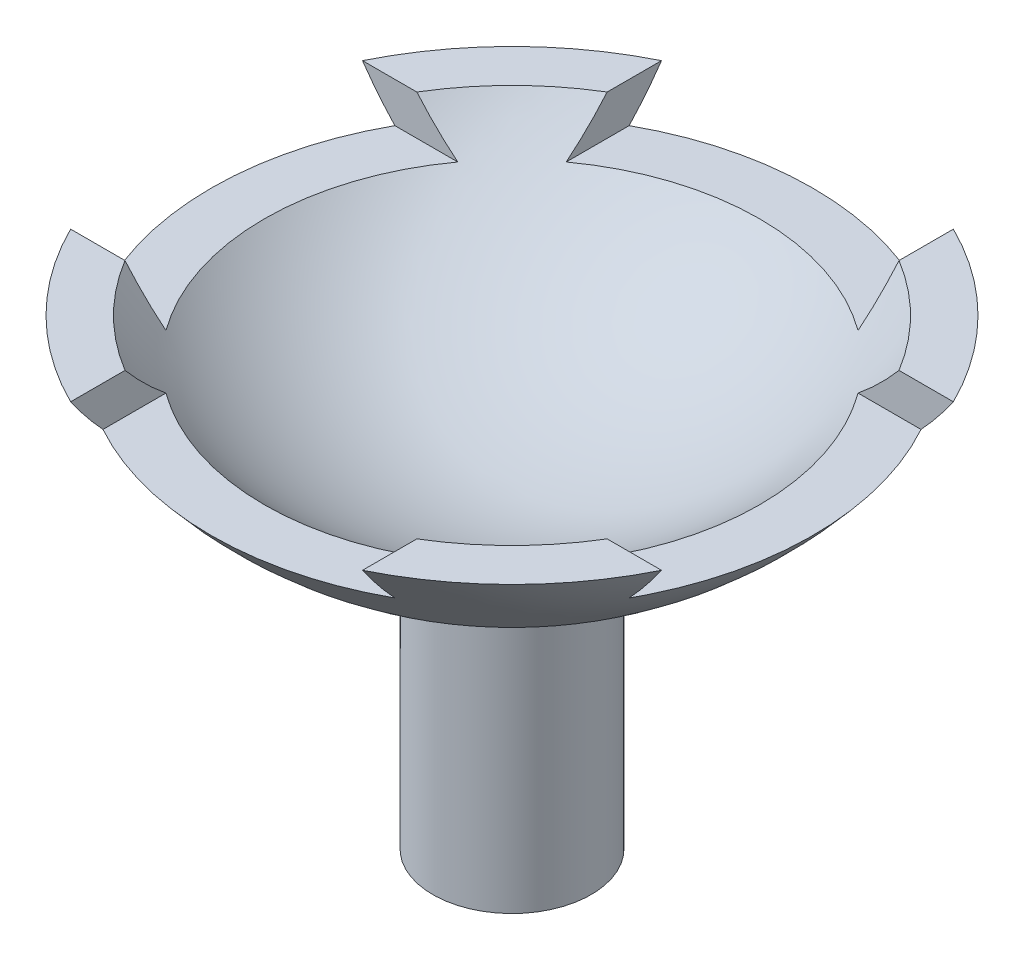
ISO-10303-21;
HEADER;
FILE_DESCRIPTION(('STEP AP214'),'2;1');
FILE_NAME('part.step','',(''),(''),'','','');
FILE_SCHEMA(('AUTOMOTIVE_DESIGN { 1 0 10303 214 1 1 1 1 }'));
ENDSEC;
DATA;
#1=APPLICATION_CONTEXT('core data for automotive mechanical design processes');
#2=APPLICATION_PROTOCOL_DEFINITION('international standard','automotive_design',2000,#1);
#3=PRODUCT_CONTEXT('',#1,'mechanical');
#4=PRODUCT('Part','Part','',(#3));
#5=PRODUCT_RELATED_PRODUCT_CATEGORY('part','',(#4));
#6=PRODUCT_DEFINITION_FORMATION('','',#4);
#7=PRODUCT_DEFINITION_CONTEXT('part definition',#1,'design');
#8=PRODUCT_DEFINITION('design','',#6,#7);
#9=PRODUCT_DEFINITION_SHAPE('','',#8);
#10=(LENGTH_UNIT() NAMED_UNIT(*) SI_UNIT(.MILLI.,.METRE.));
#11=(NAMED_UNIT(*) PLANE_ANGLE_UNIT() SI_UNIT($,.RADIAN.));
#12=(NAMED_UNIT(*) SI_UNIT($,.STERADIAN.) SOLID_ANGLE_UNIT());
#13=UNCERTAINTY_MEASURE_WITH_UNIT(LENGTH_MEASURE(1.E-05),#10,'distance_accuracy_value','');
#14=(GEOMETRIC_REPRESENTATION_CONTEXT(3) GLOBAL_UNCERTAINTY_ASSIGNED_CONTEXT((#13)) GLOBAL_UNIT_ASSIGNED_CONTEXT((#10,
#11,#12)) REPRESENTATION_CONTEXT('',''));
#15=CARTESIAN_POINT('',(0.,0.,0.));
#16=DIRECTION('',(0.,0.,1.));
#17=DIRECTION('',(1.,0.,0.));
#18=AXIS2_PLACEMENT_3D('',#15,#16,#17);
#19=CARTESIAN_POINT('',(0.,50.5312438925075,0.));
#20=DIRECTION('',(0.,1.,0.));
#21=DIRECTION('',(1.,0.,0.));
#22=AXIS2_PLACEMENT_3D('',#19,#20,#21);
#23=SPHERICAL_SURFACE('',#22,29.4);
#24=CARTESIAN_POINT('',(0.,22.0103986648705,0.));
#25=DIRECTION('',(0.,1.,0.));
#26=DIRECTION('',(-1.,0.,0.));
#27=AXIS2_PLACEMENT_3D('',#24,#25,#26);
#28=CIRCLE('',#27,7.13592233009709);
#29=CARTESIAN_POINT('',(-7.1359223300971,22.0103986648705,0.));
#30=VERTEX_POINT('',#29);
#31=EDGE_CURVE('E50',#30,#30,#28,.T.);
#32=ORIENTED_EDGE('',*,*,#31,.T.);
#33=EDGE_LOOP('',(#32));
#34=FACE_BOUND('',#33,.T.);
#35=CARTESIAN_POINT('',(0.,50.5312438925075,11.055));
#36=DIRECTION('',(0.,0.,1.));
#37=DIRECTION('',(1.,0.,0.));
#38=AXIS2_PLACEMENT_3D('',#35,#36,#37);
#39=CIRCLE('',#38,27.2423746211669);
#40=CARTESIAN_POINT('',(-19.9312788171006,31.96,11.0550000000001));
#41=VERTEX_POINT('',#40);
#42=CARTESIAN_POINT('',(-22.3814083147475,35.,11.0550000000001));
#43=VERTEX_POINT('',#42);
#44=EDGE_CURVE('E183',#41,#43,#39,.F.);
#45=ORIENTED_EDGE('',*,*,#44,.F.);
#46=CARTESIAN_POINT('',(0.,31.96,0.));
#47=DIRECTION('',(0.,-1.,0.));
#48=DIRECTION('',(1.,0.,0.));
#49=AXIS2_PLACEMENT_3D('',#46,#47,#48);
#50=CIRCLE('',#49,22.7918603954351);
#51=CARTESIAN_POINT('',(-19.9312788171006,31.96,-11.0549999999999));
#52=VERTEX_POINT('',#51);
#53=EDGE_CURVE('E166',#52,#41,#50,.F.);
#54=ORIENTED_EDGE('',*,*,#53,.F.);
#55=CARTESIAN_POINT('',(0.,50.5312438925075,-11.055));
#56=DIRECTION('',(0.,0.,-1.));
#57=DIRECTION('',(-1.,0.,0.));
#58=AXIS2_PLACEMENT_3D('',#55,#56,#57);
#59=CIRCLE('',#58,27.2423746211669);
#60=CARTESIAN_POINT('',(-22.3814083147475,35.,-11.0549999999999));
#61=VERTEX_POINT('',#60);
#62=EDGE_CURVE('E158',#61,#52,#59,.F.);
#63=ORIENTED_EDGE('',*,*,#62,.F.);
#64=CARTESIAN_POINT('',(0.,35.,0.));
#65=DIRECTION('',(0.,1.,0.));
#66=DIRECTION('',(-1.,0.,0.));
#67=AXIS2_PLACEMENT_3D('',#64,#65,#66);
#68=CIRCLE('',#67,24.9627815587816);
#69=CARTESIAN_POINT('',(-11.055,35.,-22.3814083147475));
#70=VERTEX_POINT('',#69);
#71=EDGE_CURVE('E264',#70,#61,#68,.T.);
#72=ORIENTED_EDGE('',*,*,#71,.F.);
#73=CARTESIAN_POINT('',(-11.055,50.5312438925075,0.));
#74=DIRECTION('',(-1.,0.,0.));
#75=DIRECTION('',(0.,0.,1.));
#76=AXIS2_PLACEMENT_3D('',#73,#74,#75);
#77=CIRCLE('',#76,27.2423746211669);
#78=CARTESIAN_POINT('',(-11.055,31.96,-19.9312788171006));
#79=VERTEX_POINT('',#78);
#80=EDGE_CURVE('E244',#79,#70,#77,.F.);
#81=ORIENTED_EDGE('',*,*,#80,.F.);
#82=CARTESIAN_POINT('',(0.,31.96,0.));
#83=DIRECTION('',(0.,-1.,0.));
#84=DIRECTION('',(0.,0.,-1.));
#85=AXIS2_PLACEMENT_3D('',#82,#83,#84);
#86=CIRCLE('',#85,22.7918603954351);
#87=CARTESIAN_POINT('',(11.055,31.96,-19.9312788171006));
#88=VERTEX_POINT('',#87);
#89=EDGE_CURVE('E256',#88,#79,#86,.F.);
#90=ORIENTED_EDGE('',*,*,#89,.F.);
#91=CARTESIAN_POINT('',(11.055,50.5312438925075,0.));
#92=DIRECTION('',(1.,0.,0.));
#93=DIRECTION('',(0.,0.,-1.));
#94=AXIS2_PLACEMENT_3D('',#91,#92,#93);
#95=CIRCLE('',#94,27.2423746211669);
#96=CARTESIAN_POINT('',(11.055,35.,-22.3814083147475));
#97=VERTEX_POINT('',#96);
#98=EDGE_CURVE('E238',#97,#88,#95,.F.);
#99=ORIENTED_EDGE('',*,*,#98,.F.);
#100=CARTESIAN_POINT('',(22.3814083147474,35.,-11.0550000000002));
#101=VERTEX_POINT('',#100);
#102=EDGE_CURVE('E263',#101,#97,#68,.T.);
#103=ORIENTED_EDGE('',*,*,#102,.F.);
#104=CARTESIAN_POINT('',(-1.19264425554686E-13,50.5312438925075,-11.055));
#105=DIRECTION('',(0.,0.,-1.));
#106=DIRECTION('',(-1.,0.,0.));
#107=AXIS2_PLACEMENT_3D('',#104,#105,#106);
#108=CIRCLE('',#107,27.2423746211669);
#109=CARTESIAN_POINT('',(19.9312788171005,31.96,-11.0550000000002));
#110=VERTEX_POINT('',#109);
#111=EDGE_CURVE('E218',#110,#101,#108,.F.);
#112=ORIENTED_EDGE('',*,*,#111,.F.);
#113=CARTESIAN_POINT('',(0.,31.96,0.));
#114=DIRECTION('',(0.,-1.,0.));
#115=DIRECTION('',(0.,0.,-1.));
#116=AXIS2_PLACEMENT_3D('',#113,#114,#115);
#117=CIRCLE('',#116,22.7918603954351);
#118=CARTESIAN_POINT('',(19.9312788171007,31.96,11.0549999999998));
#119=VERTEX_POINT('',#118);
#120=EDGE_CURVE('E194',#119,#110,#117,.F.);
#121=ORIENTED_EDGE('',*,*,#120,.F.);
#122=CARTESIAN_POINT('',(1.12325531650779E-13,50.5312438925075,11.055));
#123=DIRECTION('',(0.,0.,1.));
#124=DIRECTION('',(1.,0.,0.));
#125=AXIS2_PLACEMENT_3D('',#122,#123,#124);
#126=CIRCLE('',#125,27.2423746211669);
#127=CARTESIAN_POINT('',(22.3814083147476,35.,11.0549999999998));
#128=VERTEX_POINT('',#127);
#129=EDGE_CURVE('E216',#128,#119,#126,.F.);
#130=ORIENTED_EDGE('',*,*,#129,.F.);
#131=CARTESIAN_POINT('',(11.055,35.,22.3814083147475));
#132=VERTEX_POINT('',#131);
#133=EDGE_CURVE('E332',#132,#128,#68,.T.);
#134=ORIENTED_EDGE('',*,*,#133,.F.);
#135=CARTESIAN_POINT('',(11.055,50.5312438925075,0.));
#136=DIRECTION('',(1.,0.,0.));
#137=DIRECTION('',(0.,1.,0.));
#138=AXIS2_PLACEMENT_3D('',#135,#136,#137);
#139=CIRCLE('',#138,27.2423746211669);
#140=CARTESIAN_POINT('',(11.055,31.96,19.9312788171006));
#141=VERTEX_POINT('',#140);
#142=EDGE_CURVE('E200',#141,#132,#139,.F.);
#143=ORIENTED_EDGE('',*,*,#142,.F.);
#144=CARTESIAN_POINT('',(0.,31.96,0.));
#145=DIRECTION('',(0.,-1.,0.));
#146=DIRECTION('',(1.,0.,0.));
#147=AXIS2_PLACEMENT_3D('',#144,#145,#146);
#148=CIRCLE('',#147,22.7918603954351);
#149=CARTESIAN_POINT('',(-11.055,31.96,19.9312788171006));
#150=VERTEX_POINT('',#149);
#151=EDGE_CURVE('E180',#150,#141,#148,.F.);
#152=ORIENTED_EDGE('',*,*,#151,.F.);
#153=CARTESIAN_POINT('',(-11.055,50.5312438925075,0.));
#154=DIRECTION('',(-1.,0.,0.));
#155=DIRECTION('',(0.,-1.,0.));
#156=AXIS2_PLACEMENT_3D('',#153,#154,#155);
#157=CIRCLE('',#156,27.2423746211669);
#158=CARTESIAN_POINT('',(-11.055,35.,22.3814083147475));
#159=VERTEX_POINT('',#158);
#160=EDGE_CURVE('E198',#159,#150,#157,.F.);
#161=ORIENTED_EDGE('',*,*,#160,.F.);
#162=EDGE_CURVE('E267',#43,#159,#68,.T.);
#163=ORIENTED_EDGE('',*,*,#162,.F.);
#164=EDGE_LOOP('',(#45,#54,#63,#72,#81,#90,#99,#103,#112,#121,#130,#134,#143,#152,#161,#163));
#165=FACE_BOUND('',#164,.T.);
#166=ADVANCED_FACE('F39',(#34,#165),#23,.T.);
#167=CARTESIAN_POINT('',(21.3480786758773,35.,0.));
#168=DIRECTION('',(0.,-1.,0.));
#169=DIRECTION('',(1.,0.,0.));
#170=AXIS2_PLACEMENT_3D('',#167,#168,#169);
#171=PLANE('',#170);
#172=DIRECTION('',(1.,0.,0.));
#173=VECTOR('',#172,1.);
#174=CARTESIAN_POINT('',(-24.9637815587817,35.,11.0550000000001));
#175=LINE('',#174,#173);
#176=CARTESIAN_POINT('',(-18.2627335892371,35.,11.0550000000001));
#177=VERTEX_POINT('',#176);
#178=EDGE_CURVE('E168',#43,#177,#175,.T.);
#179=ORIENTED_EDGE('',*,*,#178,.F.);
#180=ORIENTED_EDGE('',*,*,#162,.T.);
#181=DIRECTION('',(0.,0.,-1.));
#182=VECTOR('',#181,1.);
#183=CARTESIAN_POINT('',(-11.055,35.,24.9637815587816));
#184=LINE('',#183,#182);
#185=CARTESIAN_POINT('',(-11.055,35.,18.2627335892371));
#186=VERTEX_POINT('',#185);
#187=EDGE_CURVE('E204',#159,#186,#184,.T.);
#188=ORIENTED_EDGE('',*,*,#187,.T.);
#189=CARTESIAN_POINT('',(0.,35.,0.));
#190=DIRECTION('',(0.,1.,0.));
#191=DIRECTION('',(-1.,0.,0.));
#192=AXIS2_PLACEMENT_3D('',#189,#190,#191);
#193=CIRCLE('',#192,21.3480786758773);
#194=EDGE_CURVE('E262',#177,#186,#193,.T.);
#195=ORIENTED_EDGE('',*,*,#194,.F.);
#196=EDGE_LOOP('',(#179,#180,#188,#195));
#197=FACE_BOUND('',#196,.T.);
#198=ADVANCED_FACE('F283',(#197),#171,.F.);
#199=DIRECTION('',(0.,0.,-1.));
#200=VECTOR('',#199,1.);
#201=CARTESIAN_POINT('',(11.055,35.,24.9637815587816));
#202=LINE('',#201,#200);
#203=CARTESIAN_POINT('',(11.055,35.,18.2627335892371));
#204=VERTEX_POINT('',#203);
#205=EDGE_CURVE('E205',#132,#204,#202,.T.);
#206=ORIENTED_EDGE('',*,*,#205,.F.);
#207=ORIENTED_EDGE('',*,*,#133,.T.);
#208=DIRECTION('',(-1.,0.,0.));
#209=VECTOR('',#208,1.);
#210=CARTESIAN_POINT('',(24.963781558782,35.,11.0549999999997));
#211=LINE('',#210,#209);
#212=CARTESIAN_POINT('',(18.2627335892372,35.,11.0549999999998));
#213=VERTEX_POINT('',#212);
#214=EDGE_CURVE('E223',#128,#213,#211,.T.);
#215=ORIENTED_EDGE('',*,*,#214,.T.);
#216=EDGE_CURVE('E350',#204,#213,#193,.T.);
#217=ORIENTED_EDGE('',*,*,#216,.F.);
#218=EDGE_LOOP('',(#206,#207,#215,#217));
#219=FACE_BOUND('',#218,.T.);
#220=ADVANCED_FACE('F287',(#219),#171,.F.);
#221=DIRECTION('',(-1.,0.,0.));
#222=VECTOR('',#221,1.);
#223=CARTESIAN_POINT('',(24.9637815587818,35.,-11.0550000000003));
#224=LINE('',#223,#222);
#225=CARTESIAN_POINT('',(18.262733589237,35.,-11.0550000000002));
#226=VERTEX_POINT('',#225);
#227=EDGE_CURVE('E225',#101,#226,#224,.T.);
#228=ORIENTED_EDGE('',*,*,#227,.F.);
#229=ORIENTED_EDGE('',*,*,#102,.T.);
#230=DIRECTION('',(0.,0.,1.));
#231=VECTOR('',#230,1.);
#232=CARTESIAN_POINT('',(11.055,35.,-24.9637815587816));
#233=LINE('',#232,#231);
#234=CARTESIAN_POINT('',(11.055,35.,-18.2627335892371));
#235=VERTEX_POINT('',#234);
#236=EDGE_CURVE('E249',#97,#235,#233,.T.);
#237=ORIENTED_EDGE('',*,*,#236,.T.);
#238=EDGE_CURVE('E261',#226,#235,#193,.T.);
#239=ORIENTED_EDGE('',*,*,#238,.F.);
#240=EDGE_LOOP('',(#228,#229,#237,#239));
#241=FACE_BOUND('',#240,.T.);
#242=ADVANCED_FACE('F307',(#241),#171,.F.);
#243=CARTESIAN_POINT('',(0.,50.5312438925075,0.));
#244=DIRECTION('',(0.,1.,0.));
#245=DIRECTION('',(1.,0.,0.));
#246=AXIS2_PLACEMENT_3D('',#243,#244,#245);
#247=SPHERICAL_SURFACE('',#246,26.4);
#248=CARTESIAN_POINT('',(0.,50.5312438925075,11.055));
#249=DIRECTION('',(0.,0.,1.));
#250=DIRECTION('',(1.,0.,0.));
#251=AXIS2_PLACEMENT_3D('',#248,#249,#250);
#252=CIRCLE('',#251,23.9738811000639);
#253=CARTESIAN_POINT('',(-15.1609984923488,31.96,11.0550000000001));
#254=VERTEX_POINT('',#253);
#255=EDGE_CURVE('E53',#177,#254,#252,.T.);
#256=ORIENTED_EDGE('',*,*,#255,.F.);
#257=ORIENTED_EDGE('',*,*,#194,.T.);
#258=CARTESIAN_POINT('',(-11.055,50.5312438925075,0.));
#259=DIRECTION('',(-1.,0.,0.));
#260=DIRECTION('',(0.,-1.,0.));
#261=AXIS2_PLACEMENT_3D('',#258,#259,#260);
#262=CIRCLE('',#261,23.9738811000639);
#263=CARTESIAN_POINT('',(-11.055,31.96,15.1609984923488));
#264=VERTEX_POINT('',#263);
#265=EDGE_CURVE('E195',#264,#186,#262,.T.);
#266=ORIENTED_EDGE('',*,*,#265,.F.);
#267=CARTESIAN_POINT('',(0.,31.96,0.));
#268=DIRECTION('',(0.,-1.,0.));
#269=DIRECTION('',(1.,0.,0.));
#270=AXIS2_PLACEMENT_3D('',#267,#268,#269);
#271=CIRCLE('',#270,18.7634991482134);
#272=CARTESIAN_POINT('',(11.055,31.96,15.1609984923488));
#273=VERTEX_POINT('',#272);
#274=EDGE_CURVE('E182',#273,#264,#271,.T.);
#275=ORIENTED_EDGE('',*,*,#274,.F.);
#276=CARTESIAN_POINT('',(11.055,50.5312438925075,0.));
#277=DIRECTION('',(1.,0.,0.));
#278=DIRECTION('',(0.,1.,0.));
#279=AXIS2_PLACEMENT_3D('',#276,#277,#278);
#280=CIRCLE('',#279,23.9738811000639);
#281=EDGE_CURVE('E65',#204,#273,#280,.T.);
#282=ORIENTED_EDGE('',*,*,#281,.F.);
#283=ORIENTED_EDGE('',*,*,#216,.T.);
#284=CARTESIAN_POINT('',(1.12325531650779E-13,50.5312438925075,11.055));
#285=DIRECTION('',(0.,0.,1.));
#286=DIRECTION('',(1.,0.,0.));
#287=AXIS2_PLACEMENT_3D('',#284,#285,#286);
#288=CIRCLE('',#287,23.9738811000639);
#289=CARTESIAN_POINT('',(15.1609984923489,31.96,11.0549999999998));
#290=VERTEX_POINT('',#289);
#291=EDGE_CURVE('E215',#290,#213,#288,.T.);
#292=ORIENTED_EDGE('',*,*,#291,.F.);
#293=CARTESIAN_POINT('',(0.,31.96,0.));
#294=DIRECTION('',(0.,-1.,0.));
#295=DIRECTION('',(0.,0.,-1.));
#296=AXIS2_PLACEMENT_3D('',#293,#294,#295);
#297=CIRCLE('',#296,18.7634991482134);
#298=CARTESIAN_POINT('',(15.1609984923487,31.96,-11.0550000000002));
#299=VERTEX_POINT('',#298);
#300=EDGE_CURVE('E221',#299,#290,#297,.T.);
#301=ORIENTED_EDGE('',*,*,#300,.F.);
#302=CARTESIAN_POINT('',(-1.19264425554686E-13,50.5312438925075,-11.055));
#303=DIRECTION('',(0.,0.,-1.));
#304=DIRECTION('',(-1.,0.,0.));
#305=AXIS2_PLACEMENT_3D('',#302,#303,#304);
#306=CIRCLE('',#305,23.9738811000639);
#307=EDGE_CURVE('E212',#226,#299,#306,.T.);
#308=ORIENTED_EDGE('',*,*,#307,.F.);
#309=ORIENTED_EDGE('',*,*,#238,.T.);
#310=CARTESIAN_POINT('',(11.055,50.5312438925075,0.));
#311=DIRECTION('',(1.,0.,0.));
#312=DIRECTION('',(0.,0.,-1.));
#313=AXIS2_PLACEMENT_3D('',#310,#311,#312);
#314=CIRCLE('',#313,23.9738811000639);
#315=CARTESIAN_POINT('',(11.055,31.96,-15.1609984923488));
#316=VERTEX_POINT('',#315);
#317=EDGE_CURVE('E193',#316,#235,#314,.T.);
#318=ORIENTED_EDGE('',*,*,#317,.F.);
#319=CARTESIAN_POINT('',(0.,31.96,0.));
#320=DIRECTION('',(0.,-1.,0.));
#321=DIRECTION('',(0.,0.,-1.));
#322=AXIS2_PLACEMENT_3D('',#319,#320,#321);
#323=CIRCLE('',#322,18.7634991482134);
#324=CARTESIAN_POINT('',(-11.055,31.96,-15.1609984923488));
#325=VERTEX_POINT('',#324);
#326=EDGE_CURVE('E246',#325,#316,#323,.T.);
#327=ORIENTED_EDGE('',*,*,#326,.F.);
#328=CARTESIAN_POINT('',(-11.055,50.5312438925075,0.));
#329=DIRECTION('',(-1.,0.,0.));
#330=DIRECTION('',(0.,0.,1.));
#331=AXIS2_PLACEMENT_3D('',#328,#329,#330);
#332=CIRCLE('',#331,23.9738811000639);
#333=CARTESIAN_POINT('',(-11.055,35.,-18.2627335892371));
#334=VERTEX_POINT('',#333);
#335=EDGE_CURVE('E236',#334,#325,#332,.T.);
#336=ORIENTED_EDGE('',*,*,#335,.F.);
#337=CARTESIAN_POINT('',(-18.2627335892371,35.,-11.0549999999999));
#338=VERTEX_POINT('',#337);
#339=EDGE_CURVE('E178',#334,#338,#193,.T.);
#340=ORIENTED_EDGE('',*,*,#339,.T.);
#341=CARTESIAN_POINT('',(0.,50.5312438925075,-11.055));
#342=DIRECTION('',(0.,0.,-1.));
#343=DIRECTION('',(-1.,0.,0.));
#344=AXIS2_PLACEMENT_3D('',#341,#342,#343);
#345=CIRCLE('',#344,23.9738811000639);
#346=CARTESIAN_POINT('',(-15.1609984923489,31.96,-11.0549999999999));
#347=VERTEX_POINT('',#346);
#348=EDGE_CURVE('E154',#347,#338,#345,.T.);
#349=ORIENTED_EDGE('',*,*,#348,.F.);
#350=CARTESIAN_POINT('',(0.,31.96,0.));
#351=DIRECTION('',(0.,-1.,0.));
#352=DIRECTION('',(1.,0.,0.));
#353=AXIS2_PLACEMENT_3D('',#350,#351,#352);
#354=CIRCLE('',#353,18.7634991482133);
#355=EDGE_CURVE('E167',#254,#347,#354,.T.);
#356=ORIENTED_EDGE('',*,*,#355,.F.);
#357=EDGE_LOOP('',(#256,#257,#266,#275,#282,#283,#292,#301,#308,#309,#318,#327,#336,#340,#349,#356));
#358=FACE_BOUND('',#357,.T.);
#359=ADVANCED_FACE('F174',(#358),#247,.F.);
#360=ORIENTED_EDGE('',*,*,#71,.T.);
#361=DIRECTION('',(1.,0.,0.));
#362=VECTOR('',#361,1.);
#363=CARTESIAN_POINT('',(-24.9637815587818,35.,-11.0549999999999));
#364=LINE('',#363,#362);
#365=EDGE_CURVE('E165',#61,#338,#364,.T.);
#366=ORIENTED_EDGE('',*,*,#365,.T.);
#367=ORIENTED_EDGE('',*,*,#339,.F.);
#368=DIRECTION('',(0.,0.,1.));
#369=VECTOR('',#368,1.);
#370=CARTESIAN_POINT('',(-11.055,35.,-24.9637815587816));
#371=LINE('',#370,#369);
#372=EDGE_CURVE('E248',#70,#334,#371,.T.);
#373=ORIENTED_EDGE('',*,*,#372,.F.);
#374=EDGE_LOOP('',(#360,#366,#367,#373));
#375=FACE_BOUND('',#374,.T.);
#376=ADVANCED_FACE('F291',(#375),#171,.F.);
#377=CARTESIAN_POINT('',(0.,0.,0.));
#378=DIRECTION('',(0.,1.,0.));
#379=DIRECTION('',(-1.,0.,0.));
#380=AXIS2_PLACEMENT_3D('',#377,#378,#379);
#381=PLANE('',#380);
#382=CARTESIAN_POINT('',(0.,0.,0.));
#383=DIRECTION('',(0.,1.,0.));
#384=DIRECTION('',(-1.,0.,0.));
#385=AXIS2_PLACEMENT_3D('',#382,#383,#384);
#386=CIRCLE('',#385,6.);
#387=CARTESIAN_POINT('',(-6.,0.,0.));
#388=VERTEX_POINT('',#387);
#389=EDGE_CURVE('E268',#388,#388,#386,.T.);
#390=ORIENTED_EDGE('',*,*,#389,.F.);
#391=EDGE_LOOP('',(#390));
#392=FACE_BOUND('',#391,.T.);
#393=ADVANCED_FACE('F299',(#392),#381,.F.);
#394=CARTESIAN_POINT('',(0.,21.1312438925075,0.));
#395=DIRECTION('',(0.,1.,0.));
#396=DIRECTION('',(-1.,0.,0.));
#397=AXIS2_PLACEMENT_3D('',#394,#395,#396);
#398=CYLINDRICAL_SURFACE('',#397,6.);
#399=CARTESIAN_POINT('',(0.,20.5552535001952,0.));
#400=DIRECTION('',(0.,1.,0.));
#401=DIRECTION('',(-1.,0.,0.));
#402=AXIS2_PLACEMENT_3D('',#399,#400,#401);
#403=CIRCLE('',#402,6.);
#404=CARTESIAN_POINT('',(-6.,20.5552535001952,0.));
#405=VERTEX_POINT('',#404);
#406=EDGE_CURVE('E11',#405,#405,#403,.F.);
#407=ORIENTED_EDGE('',*,*,#406,.T.);
#408=EDGE_LOOP('',(#407));
#409=FACE_BOUND('',#408,.T.);
#410=ORIENTED_EDGE('',*,*,#389,.T.);
#411=EDGE_LOOP('',(#410));
#412=FACE_BOUND('',#411,.T.);
#413=ADVANCED_FACE('F297',(#409,#412),#398,.T.);
#414=CARTESIAN_POINT('',(-11.055,35.,-24.9637815587816));
#415=DIRECTION('',(-1.,0.,0.));
#416=DIRECTION('',(0.,0.,1.));
#417=AXIS2_PLACEMENT_3D('',#414,#415,#416);
#418=PLANE('',#417);
#419=ORIENTED_EDGE('',*,*,#80,.T.);
#420=ORIENTED_EDGE('',*,*,#372,.T.);
#421=ORIENTED_EDGE('',*,*,#335,.T.);
#422=DIRECTION('',(0.,0.,1.));
#423=VECTOR('',#422,1.);
#424=CARTESIAN_POINT('',(-11.055,31.96,-24.9637815587816));
#425=LINE('',#424,#423);
#426=EDGE_CURVE('E243',#79,#325,#425,.T.);
#427=ORIENTED_EDGE('',*,*,#426,.F.);
#428=EDGE_LOOP('',(#419,#420,#421,#427));
#429=FACE_BOUND('',#428,.T.);
#430=ADVANCED_FACE('F300',(#429),#418,.F.);
#431=CARTESIAN_POINT('',(11.055,35.,-24.9637815587816));
#432=DIRECTION('',(1.,0.,0.));
#433=DIRECTION('',(0.,0.,-1.));
#434=AXIS2_PLACEMENT_3D('',#431,#432,#433);
#435=PLANE('',#434);
#436=ORIENTED_EDGE('',*,*,#98,.T.);
#437=DIRECTION('',(0.,0.,1.));
#438=VECTOR('',#437,1.);
#439=CARTESIAN_POINT('',(11.055,31.96,-24.9637815587816));
#440=LINE('',#439,#438);
#441=EDGE_CURVE('E252',#88,#316,#440,.T.);
#442=ORIENTED_EDGE('',*,*,#441,.T.);
#443=ORIENTED_EDGE('',*,*,#317,.T.);
#444=ORIENTED_EDGE('',*,*,#236,.F.);
#445=EDGE_LOOP('',(#436,#442,#443,#444));
#446=FACE_BOUND('',#445,.T.);
#447=ADVANCED_FACE('F353',(#446),#435,.F.);
#448=CARTESIAN_POINT('',(-11.055,31.96,-24.9637815587816));
#449=DIRECTION('',(0.,-1.,0.));
#450=DIRECTION('',(0.,0.,-1.));
#451=AXIS2_PLACEMENT_3D('',#448,#449,#450);
#452=PLANE('',#451);
#453=ORIENTED_EDGE('',*,*,#89,.T.);
#454=ORIENTED_EDGE('',*,*,#426,.T.);
#455=ORIENTED_EDGE('',*,*,#326,.T.);
#456=ORIENTED_EDGE('',*,*,#441,.F.);
#457=EDGE_LOOP('',(#453,#454,#455,#456));
#458=FACE_BOUND('',#457,.T.);
#459=ADVANCED_FACE('F360',(#458),#452,.F.);
#460=CARTESIAN_POINT('',(24.9637815587818,35.,-11.0550000000003));
#461=DIRECTION('',(0.,0.,-1.));
#462=DIRECTION('',(-1.,0.,0.));
#463=AXIS2_PLACEMENT_3D('',#460,#461,#462);
#464=PLANE('',#463);
#465=ORIENTED_EDGE('',*,*,#111,.T.);
#466=ORIENTED_EDGE('',*,*,#227,.T.);
#467=ORIENTED_EDGE('',*,*,#307,.T.);
#468=DIRECTION('',(-1.,0.,0.));
#469=VECTOR('',#468,1.);
#470=CARTESIAN_POINT('',(24.9637815587818,31.96,-11.0550000000003));
#471=LINE('',#470,#469);
#472=EDGE_CURVE('E222',#110,#299,#471,.T.);
#473=ORIENTED_EDGE('',*,*,#472,.F.);
#474=EDGE_LOOP('',(#465,#466,#467,#473));
#475=FACE_BOUND('',#474,.T.);
#476=ADVANCED_FACE('F369',(#475),#464,.F.);
#477=CARTESIAN_POINT('',(24.963781558782,35.,11.0549999999997));
#478=DIRECTION('',(0.,0.,1.));
#479=DIRECTION('',(1.,0.,0.));
#480=AXIS2_PLACEMENT_3D('',#477,#478,#479);
#481=PLANE('',#480);
#482=ORIENTED_EDGE('',*,*,#129,.T.);
#483=DIRECTION('',(-1.,0.,0.));
#484=VECTOR('',#483,1.);
#485=CARTESIAN_POINT('',(24.963781558782,31.96,11.0549999999997));
#486=LINE('',#485,#484);
#487=EDGE_CURVE('E229',#119,#290,#486,.T.);
#488=ORIENTED_EDGE('',*,*,#487,.T.);
#489=ORIENTED_EDGE('',*,*,#291,.T.);
#490=ORIENTED_EDGE('',*,*,#214,.F.);
#491=EDGE_LOOP('',(#482,#488,#489,#490));
#492=FACE_BOUND('',#491,.T.);
#493=ADVANCED_FACE('F375',(#492),#481,.F.);
#494=CARTESIAN_POINT('',(24.9637815587818,31.96,-11.0550000000003));
#495=DIRECTION('',(0.,-1.,0.));
#496=DIRECTION('',(0.,0.,-1.));
#497=AXIS2_PLACEMENT_3D('',#494,#495,#496);
#498=PLANE('',#497);
#499=ORIENTED_EDGE('',*,*,#120,.T.);
#500=ORIENTED_EDGE('',*,*,#472,.T.);
#501=ORIENTED_EDGE('',*,*,#300,.T.);
#502=ORIENTED_EDGE('',*,*,#487,.F.);
#503=EDGE_LOOP('',(#499,#500,#501,#502));
#504=FACE_BOUND('',#503,.T.);
#505=ADVANCED_FACE('F373',(#504),#498,.F.);
#506=CARTESIAN_POINT('',(11.055,35.,24.9637815587816));
#507=DIRECTION('',(1.,0.,0.));
#508=DIRECTION('',(0.,1.,0.));
#509=AXIS2_PLACEMENT_3D('',#506,#507,#508);
#510=PLANE('',#509);
#511=ORIENTED_EDGE('',*,*,#142,.T.);
#512=ORIENTED_EDGE('',*,*,#205,.T.);
#513=ORIENTED_EDGE('',*,*,#281,.T.);
#514=DIRECTION('',(0.,0.,-1.));
#515=VECTOR('',#514,1.);
#516=CARTESIAN_POINT('',(11.055,31.96,24.9637815587816));
#517=LINE('',#516,#515);
#518=EDGE_CURVE('E203',#141,#273,#517,.T.);
#519=ORIENTED_EDGE('',*,*,#518,.F.);
#520=EDGE_LOOP('',(#511,#512,#513,#519));
#521=FACE_BOUND('',#520,.T.);
#522=ADVANCED_FACE('F376',(#521),#510,.F.);
#523=CARTESIAN_POINT('',(-11.055,35.,24.9637815587816));
#524=DIRECTION('',(-1.,0.,0.));
#525=DIRECTION('',(0.,-1.,0.));
#526=AXIS2_PLACEMENT_3D('',#523,#524,#525);
#527=PLANE('',#526);
#528=ORIENTED_EDGE('',*,*,#160,.T.);
#529=DIRECTION('',(0.,0.,-1.));
#530=VECTOR('',#529,1.);
#531=CARTESIAN_POINT('',(-11.055,31.96,24.9637815587816));
#532=LINE('',#531,#530);
#533=EDGE_CURVE('E210',#150,#264,#532,.T.);
#534=ORIENTED_EDGE('',*,*,#533,.T.);
#535=ORIENTED_EDGE('',*,*,#265,.T.);
#536=ORIENTED_EDGE('',*,*,#187,.F.);
#537=EDGE_LOOP('',(#528,#534,#535,#536));
#538=FACE_BOUND('',#537,.T.);
#539=ADVANCED_FACE('F344',(#538),#527,.F.);
#540=CARTESIAN_POINT('',(11.055,31.96,24.9637815587816));
#541=DIRECTION('',(0.,-1.,0.));
#542=DIRECTION('',(1.,0.,0.));
#543=AXIS2_PLACEMENT_3D('',#540,#541,#542);
#544=PLANE('',#543);
#545=ORIENTED_EDGE('',*,*,#151,.T.);
#546=ORIENTED_EDGE('',*,*,#518,.T.);
#547=ORIENTED_EDGE('',*,*,#274,.T.);
#548=ORIENTED_EDGE('',*,*,#533,.F.);
#549=EDGE_LOOP('',(#545,#546,#547,#548));
#550=FACE_BOUND('',#549,.T.);
#551=ADVANCED_FACE('F382',(#550),#544,.F.);
#552=CARTESIAN_POINT('',(-24.9637815587817,35.,11.0550000000001));
#553=DIRECTION('',(0.,0.,1.));
#554=DIRECTION('',(1.,0.,0.));
#555=AXIS2_PLACEMENT_3D('',#552,#553,#554);
#556=PLANE('',#555);
#557=ORIENTED_EDGE('',*,*,#44,.T.);
#558=ORIENTED_EDGE('',*,*,#178,.T.);
#559=ORIENTED_EDGE('',*,*,#255,.T.);
#560=DIRECTION('',(1.,0.,0.));
#561=VECTOR('',#560,1.);
#562=CARTESIAN_POINT('',(-24.9637815587817,31.96,11.0550000000001));
#563=LINE('',#562,#561);
#564=EDGE_CURVE('E162',#41,#254,#563,.T.);
#565=ORIENTED_EDGE('',*,*,#564,.F.);
#566=EDGE_LOOP('',(#557,#558,#559,#565));
#567=FACE_BOUND('',#566,.T.);
#568=ADVANCED_FACE('F387',(#567),#556,.F.);
#569=CARTESIAN_POINT('',(-24.9637815587818,35.,-11.0549999999999));
#570=DIRECTION('',(0.,0.,-1.));
#571=DIRECTION('',(-1.,0.,0.));
#572=AXIS2_PLACEMENT_3D('',#569,#570,#571);
#573=PLANE('',#572);
#574=ORIENTED_EDGE('',*,*,#62,.T.);
#575=DIRECTION('',(1.,0.,0.));
#576=VECTOR('',#575,1.);
#577=CARTESIAN_POINT('',(-24.9637815587818,31.96,-11.0549999999999));
#578=LINE('',#577,#576);
#579=EDGE_CURVE('E151',#52,#347,#578,.T.);
#580=ORIENTED_EDGE('',*,*,#579,.T.);
#581=ORIENTED_EDGE('',*,*,#348,.T.);
#582=ORIENTED_EDGE('',*,*,#365,.F.);
#583=EDGE_LOOP('',(#574,#580,#581,#582));
#584=FACE_BOUND('',#583,.T.);
#585=ADVANCED_FACE('F153',(#584),#573,.F.);
#586=CARTESIAN_POINT('',(-24.9637815587817,31.96,11.0550000000001));
#587=DIRECTION('',(0.,-1.,0.));
#588=DIRECTION('',(1.,0.,0.));
#589=AXIS2_PLACEMENT_3D('',#586,#587,#588);
#590=PLANE('',#589);
#591=ORIENTED_EDGE('',*,*,#53,.T.);
#592=ORIENTED_EDGE('',*,*,#564,.T.);
#593=ORIENTED_EDGE('',*,*,#355,.T.);
#594=ORIENTED_EDGE('',*,*,#579,.F.);
#595=EDGE_LOOP('',(#591,#592,#593,#594));
#596=FACE_BOUND('',#595,.T.);
#597=ADVANCED_FACE('F170',(#596),#590,.F.);
#598=CARTESIAN_POINT('',(0.,20.5552535001952,0.));
#599=DIRECTION('',(0.,1.,0.));
#600=DIRECTION('',(-1.,0.,0.));
#601=AXIS2_PLACEMENT_3D('',#598,#599,#600);
#602=TOROIDAL_SURFACE('',#601,7.5,1.5);
#603=ORIENTED_EDGE('',*,*,#406,.F.);
#604=EDGE_LOOP('',(#603));
#605=FACE_BOUND('',#604,.T.);
#606=ORIENTED_EDGE('',*,*,#31,.F.);
#607=EDGE_LOOP('',(#606));
#608=FACE_BOUND('',#607,.T.);
#609=ADVANCED_FACE('F41',(#605,#608),#602,.F.);
#610=CLOSED_SHELL('',(#166,#198,#220,#242,#359,#376,#393,#413,#430,#447,#459,#476,#493,#505,
#522,#539,#551,#568,#585,#597,#609));
#611=MANIFOLD_SOLID_BREP('B2',#610);
#612=ADVANCED_BREP_SHAPE_REPRESENTATION('',(#18,#611),#14);
#613=SHAPE_DEFINITION_REPRESENTATION(#9,#612);
ENDSEC;
END-ISO-10303-21;
